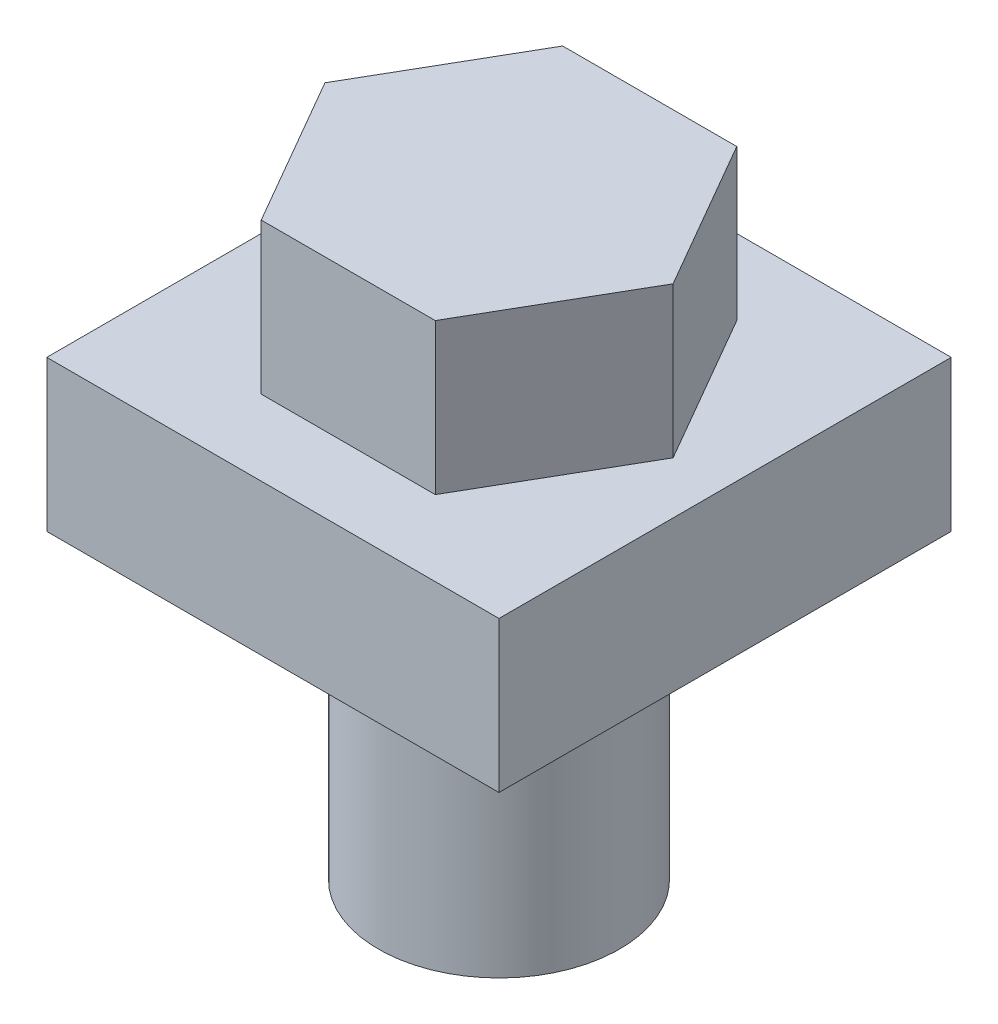
ISO-10303-21;
HEADER;
FILE_DESCRIPTION(('STEP AP214'),'2;1');
FILE_NAME('part.step','',(''),(''),'','','');
FILE_SCHEMA(('AUTOMOTIVE_DESIGN { 1 0 10303 214 1 1 1 1 }'));
ENDSEC;
DATA;
#1=APPLICATION_CONTEXT('core data for automotive mechanical design processes');
#2=APPLICATION_PROTOCOL_DEFINITION('international standard','automotive_design',2000,#1);
#3=PRODUCT_CONTEXT('',#1,'mechanical');
#4=PRODUCT('Part','Part','',(#3));
#5=PRODUCT_RELATED_PRODUCT_CATEGORY('part','',(#4));
#6=PRODUCT_DEFINITION_FORMATION('','',#4);
#7=PRODUCT_DEFINITION_CONTEXT('part definition',#1,'design');
#8=PRODUCT_DEFINITION('design','',#6,#7);
#9=PRODUCT_DEFINITION_SHAPE('','',#8);
#10=(LENGTH_UNIT() NAMED_UNIT(*) SI_UNIT(.MILLI.,.METRE.));
#11=(NAMED_UNIT(*) PLANE_ANGLE_UNIT() SI_UNIT($,.RADIAN.));
#12=(NAMED_UNIT(*) SI_UNIT($,.STERADIAN.) SOLID_ANGLE_UNIT());
#13=UNCERTAINTY_MEASURE_WITH_UNIT(LENGTH_MEASURE(1.E-05),#10,'distance_accuracy_value','');
#14=(GEOMETRIC_REPRESENTATION_CONTEXT(3) GLOBAL_UNCERTAINTY_ASSIGNED_CONTEXT((#13)) GLOBAL_UNIT_ASSIGNED_CONTEXT((#10,
#11,#12)) REPRESENTATION_CONTEXT('',''));
#15=CARTESIAN_POINT('',(0.,0.,0.));
#16=DIRECTION('',(0.,0.,1.));
#17=DIRECTION('',(1.,0.,0.));
#18=AXIS2_PLACEMENT_3D('',#15,#16,#17);
#19=CARTESIAN_POINT('',(-7.5,5.,7.5));
#20=DIRECTION('',(1.,0.,0.));
#21=DIRECTION('',(0.,0.,-1.));
#22=AXIS2_PLACEMENT_3D('',#19,#20,#21);
#23=PLANE('',#22);
#24=DIRECTION('',(0.,0.,1.));
#25=VECTOR('',#24,1.);
#26=CARTESIAN_POINT('',(-7.5,0.,7.5));
#27=LINE('',#26,#25);
#28=CARTESIAN_POINT('',(-7.5,0.,-7.5));
#29=VERTEX_POINT('',#28);
#30=CARTESIAN_POINT('',(-7.5,0.,7.5));
#31=VERTEX_POINT('',#30);
#32=EDGE_CURVE('E134',#29,#31,#27,.T.);
#33=ORIENTED_EDGE('',*,*,#32,.T.);
#34=DIRECTION('',(0.,-1.,0.));
#35=VECTOR('',#34,1.);
#36=CARTESIAN_POINT('',(-7.5,5.,7.5));
#37=LINE('',#36,#35);
#38=CARTESIAN_POINT('',(-7.5,5.,7.5));
#39=VERTEX_POINT('',#38);
#40=EDGE_CURVE('E40',#39,#31,#37,.T.);
#41=ORIENTED_EDGE('',*,*,#40,.F.);
#42=DIRECTION('',(0.,0.,1.));
#43=VECTOR('',#42,1.);
#44=CARTESIAN_POINT('',(-7.5,5.,7.5));
#45=LINE('',#44,#43);
#46=CARTESIAN_POINT('',(-7.5,5.,-7.5));
#47=VERTEX_POINT('',#46);
#48=EDGE_CURVE('E143',#47,#39,#45,.T.);
#49=ORIENTED_EDGE('',*,*,#48,.F.);
#50=DIRECTION('',(0.,-1.,0.));
#51=VECTOR('',#50,1.);
#52=CARTESIAN_POINT('',(-7.5,5.,-7.5));
#53=LINE('',#52,#51);
#54=EDGE_CURVE('E152',#47,#29,#53,.T.);
#55=ORIENTED_EDGE('',*,*,#54,.T.);
#56=EDGE_LOOP('',(#33,#41,#49,#55));
#57=FACE_BOUND('',#56,.T.);
#58=ADVANCED_FACE('F37',(#57),#23,.F.);
#59=CARTESIAN_POINT('',(7.5,5.,7.5));
#60=DIRECTION('',(0.,0.,-1.));
#61=DIRECTION('',(-1.,0.,0.));
#62=AXIS2_PLACEMENT_3D('',#59,#60,#61);
#63=PLANE('',#62);
#64=DIRECTION('',(1.,0.,0.));
#65=VECTOR('',#64,1.);
#66=CARTESIAN_POINT('',(7.5,0.,7.5));
#67=LINE('',#66,#65);
#68=CARTESIAN_POINT('',(7.5,0.,7.5));
#69=VERTEX_POINT('',#68);
#70=EDGE_CURVE('E137',#31,#69,#67,.T.);
#71=ORIENTED_EDGE('',*,*,#70,.T.);
#72=DIRECTION('',(0.,-1.,0.));
#73=VECTOR('',#72,1.);
#74=CARTESIAN_POINT('',(7.5,5.,7.5));
#75=LINE('',#74,#73);
#76=CARTESIAN_POINT('',(7.5,5.,7.5));
#77=VERTEX_POINT('',#76);
#78=EDGE_CURVE('E162',#77,#69,#75,.T.);
#79=ORIENTED_EDGE('',*,*,#78,.F.);
#80=DIRECTION('',(1.,0.,0.));
#81=VECTOR('',#80,1.);
#82=CARTESIAN_POINT('',(7.5,5.,7.5));
#83=LINE('',#82,#81);
#84=EDGE_CURVE('E146',#39,#77,#83,.T.);
#85=ORIENTED_EDGE('',*,*,#84,.F.);
#86=ORIENTED_EDGE('',*,*,#40,.T.);
#87=EDGE_LOOP('',(#71,#79,#85,#86));
#88=FACE_BOUND('',#87,.T.);
#89=ADVANCED_FACE('F171',(#88),#63,.F.);
#90=CARTESIAN_POINT('',(7.5,5.,7.5));
#91=DIRECTION('',(-1.,0.,0.));
#92=DIRECTION('',(0.,0.,1.));
#93=AXIS2_PLACEMENT_3D('',#90,#91,#92);
#94=PLANE('',#93);
#95=DIRECTION('',(0.,0.,-1.));
#96=VECTOR('',#95,1.);
#97=CARTESIAN_POINT('',(7.5,0.,7.5));
#98=LINE('',#97,#96);
#99=CARTESIAN_POINT('',(7.5,0.,-7.5));
#100=VERTEX_POINT('',#99);
#101=EDGE_CURVE('E155',#69,#100,#98,.T.);
#102=ORIENTED_EDGE('',*,*,#101,.T.);
#103=DIRECTION('',(0.,-1.,0.));
#104=VECTOR('',#103,1.);
#105=CARTESIAN_POINT('',(7.5,5.,-7.5));
#106=LINE('',#105,#104);
#107=CARTESIAN_POINT('',(7.5,5.,-7.5));
#108=VERTEX_POINT('',#107);
#109=EDGE_CURVE('E160',#108,#100,#106,.T.);
#110=ORIENTED_EDGE('',*,*,#109,.F.);
#111=DIRECTION('',(0.,0.,-1.));
#112=VECTOR('',#111,1.);
#113=CARTESIAN_POINT('',(7.5,5.,7.5));
#114=LINE('',#113,#112);
#115=EDGE_CURVE('E149',#77,#108,#114,.T.);
#116=ORIENTED_EDGE('',*,*,#115,.F.);
#117=ORIENTED_EDGE('',*,*,#78,.T.);
#118=EDGE_LOOP('',(#102,#110,#116,#117));
#119=FACE_BOUND('',#118,.T.);
#120=ADVANCED_FACE('F180',(#119),#94,.F.);
#121=CARTESIAN_POINT('',(7.5,5.,-7.5));
#122=DIRECTION('',(0.,0.,1.));
#123=DIRECTION('',(1.,0.,0.));
#124=AXIS2_PLACEMENT_3D('',#121,#122,#123);
#125=PLANE('',#124);
#126=DIRECTION('',(-1.,0.,0.));
#127=VECTOR('',#126,1.);
#128=CARTESIAN_POINT('',(7.5,0.,-7.5));
#129=LINE('',#128,#127);
#130=EDGE_CURVE('E147',#100,#29,#129,.T.);
#131=ORIENTED_EDGE('',*,*,#130,.T.);
#132=ORIENTED_EDGE('',*,*,#54,.F.);
#133=DIRECTION('',(-1.,0.,0.));
#134=VECTOR('',#133,1.);
#135=CARTESIAN_POINT('',(7.5,5.,-7.5));
#136=LINE('',#135,#134);
#137=EDGE_CURVE('E151',#108,#47,#136,.T.);
#138=ORIENTED_EDGE('',*,*,#137,.F.);
#139=ORIENTED_EDGE('',*,*,#109,.T.);
#140=EDGE_LOOP('',(#131,#132,#138,#139));
#141=FACE_BOUND('',#140,.T.);
#142=ADVANCED_FACE('F183',(#141),#125,.F.);
#143=CARTESIAN_POINT('',(0.,5.,0.));
#144=DIRECTION('',(0.,1.,0.));
#145=DIRECTION('',(0.,0.,1.));
#146=AXIS2_PLACEMENT_3D('',#143,#144,#145);
#147=PLANE('',#146);
#148=DIRECTION('',(-1.,0.,0.));
#149=VECTOR('',#148,1.);
#150=CARTESIAN_POINT('',(2.88675134594813,5.,-5.));
#151=LINE('',#150,#149);
#152=CARTESIAN_POINT('',(2.88675134594813,5.,-5.));
#153=VERTEX_POINT('',#152);
#154=CARTESIAN_POINT('',(-2.88675134594813,5.,-5.));
#155=VERTEX_POINT('',#154);
#156=EDGE_CURVE('E52',#153,#155,#151,.T.);
#157=ORIENTED_EDGE('',*,*,#156,.F.);
#158=DIRECTION('',(-0.5,0.,-0.866025403784439));
#159=VECTOR('',#158,1.);
#160=CARTESIAN_POINT('',(5.77350269189626,5.,0.));
#161=LINE('',#160,#159);
#162=CARTESIAN_POINT('',(5.77350269189626,5.,0.));
#163=VERTEX_POINT('',#162);
#164=EDGE_CURVE('E56',#163,#153,#161,.T.);
#165=ORIENTED_EDGE('',*,*,#164,.F.);
#166=DIRECTION('',(0.5,0.,-0.866025403784439));
#167=VECTOR('',#166,1.);
#168=CARTESIAN_POINT('',(2.88675134594813,5.,5.));
#169=LINE('',#168,#167);
#170=CARTESIAN_POINT('',(2.88675134594813,5.,5.));
#171=VERTEX_POINT('',#170);
#172=EDGE_CURVE('E368',#171,#163,#169,.T.);
#173=ORIENTED_EDGE('',*,*,#172,.F.);
#174=DIRECTION('',(1.,0.,0.));
#175=VECTOR('',#174,1.);
#176=CARTESIAN_POINT('',(-2.88675134594812,5.,5.));
#177=LINE('',#176,#175);
#178=CARTESIAN_POINT('',(-2.88675134594812,5.,5.));
#179=VERTEX_POINT('',#178);
#180=EDGE_CURVE('E365',#179,#171,#177,.T.);
#181=ORIENTED_EDGE('',*,*,#180,.F.);
#182=DIRECTION('',(0.5,0.,0.866025403784438));
#183=VECTOR('',#182,1.);
#184=CARTESIAN_POINT('',(-5.77350269189626,5.,0.));
#185=LINE('',#184,#183);
#186=CARTESIAN_POINT('',(-5.77350269189626,5.,0.));
#187=VERTEX_POINT('',#186);
#188=EDGE_CURVE('E362',#187,#179,#185,.T.);
#189=ORIENTED_EDGE('',*,*,#188,.F.);
#190=DIRECTION('',(-0.5,0.,0.866025403784439));
#191=VECTOR('',#190,1.);
#192=CARTESIAN_POINT('',(-2.88675134594813,5.,-5.));
#193=LINE('',#192,#191);
#194=EDGE_CURVE('E351',#155,#187,#193,.T.);
#195=ORIENTED_EDGE('',*,*,#194,.F.);
#196=EDGE_LOOP('',(#157,#165,#173,#181,#189,#195));
#197=FACE_BOUND('',#196,.T.);
#198=ORIENTED_EDGE('',*,*,#48,.T.);
#199=ORIENTED_EDGE('',*,*,#84,.T.);
#200=ORIENTED_EDGE('',*,*,#115,.T.);
#201=ORIENTED_EDGE('',*,*,#137,.T.);
#202=EDGE_LOOP('',(#198,#199,#200,#201));
#203=FACE_BOUND('',#202,.T.);
#204=ADVANCED_FACE('F185',(#197,#203),#147,.T.);
#205=CARTESIAN_POINT('',(0.,0.,0.));
#206=DIRECTION('',(0.,1.,0.));
#207=DIRECTION('',(0.,0.,1.));
#208=AXIS2_PLACEMENT_3D('',#205,#206,#207);
#209=PLANE('',#208);
#210=CARTESIAN_POINT('',(0.,0.,0.));
#211=DIRECTION('',(0.,-1.,0.));
#212=DIRECTION('',(0.,0.,-1.));
#213=AXIS2_PLACEMENT_3D('',#210,#211,#212);
#214=CIRCLE('',#213,4.);
#215=CARTESIAN_POINT('',(0.,0.,-4.));
#216=VERTEX_POINT('',#215);
#217=EDGE_CURVE('E11',#216,#216,#214,.T.);
#218=ORIENTED_EDGE('',*,*,#217,.F.);
#219=EDGE_LOOP('',(#218));
#220=FACE_BOUND('',#219,.T.);
#221=ORIENTED_EDGE('',*,*,#32,.F.);
#222=ORIENTED_EDGE('',*,*,#130,.F.);
#223=ORIENTED_EDGE('',*,*,#101,.F.);
#224=ORIENTED_EDGE('',*,*,#70,.F.);
#225=EDGE_LOOP('',(#221,#222,#223,#224));
#226=FACE_BOUND('',#225,.T.);
#227=ADVANCED_FACE('F178',(#220,#226),#209,.F.);
#228=CARTESIAN_POINT('',(2.88675134594813,10.,-5.));
#229=DIRECTION('',(0.,0.,1.));
#230=DIRECTION('',(1.,0.,0.));
#231=AXIS2_PLACEMENT_3D('',#228,#229,#230);
#232=PLANE('',#231);
#233=ORIENTED_EDGE('',*,*,#156,.T.);
#234=DIRECTION('',(0.,-1.,0.));
#235=VECTOR('',#234,1.);
#236=CARTESIAN_POINT('',(-2.88675134594813,10.,-5.));
#237=LINE('',#236,#235);
#238=CARTESIAN_POINT('',(-2.88675134594813,10.,-5.));
#239=VERTEX_POINT('',#238);
#240=EDGE_CURVE('E117',#239,#155,#237,.T.);
#241=ORIENTED_EDGE('',*,*,#240,.F.);
#242=DIRECTION('',(-1.,0.,0.));
#243=VECTOR('',#242,1.);
#244=CARTESIAN_POINT('',(2.88675134594813,10.,-5.));
#245=LINE('',#244,#243);
#246=CARTESIAN_POINT('',(2.88675134594813,10.,-5.));
#247=VERTEX_POINT('',#246);
#248=EDGE_CURVE('E123',#247,#239,#245,.T.);
#249=ORIENTED_EDGE('',*,*,#248,.F.);
#250=DIRECTION('',(0.,-1.,0.));
#251=VECTOR('',#250,1.);
#252=CARTESIAN_POINT('',(2.88675134594813,10.,-5.));
#253=LINE('',#252,#251);
#254=EDGE_CURVE('E359',#247,#153,#253,.T.);
#255=ORIENTED_EDGE('',*,*,#254,.T.);
#256=EDGE_LOOP('',(#233,#241,#249,#255));
#257=FACE_BOUND('',#256,.T.);
#258=ADVANCED_FACE('F133',(#257),#232,.F.);
#259=CARTESIAN_POINT('',(-2.88675134594813,10.,-5.));
#260=DIRECTION('',(0.866025403784439,0.,0.5));
#261=DIRECTION('',(0.5,0.,-0.866025403784439));
#262=AXIS2_PLACEMENT_3D('',#259,#260,#261);
#263=PLANE('',#262);
#264=ORIENTED_EDGE('',*,*,#194,.T.);
#265=DIRECTION('',(0.,-1.,0.));
#266=VECTOR('',#265,1.);
#267=CARTESIAN_POINT('',(-5.77350269189626,10.,0.));
#268=LINE('',#267,#266);
#269=CARTESIAN_POINT('',(-5.77350269189626,10.,0.));
#270=VERTEX_POINT('',#269);
#271=EDGE_CURVE('E119',#270,#187,#268,.T.);
#272=ORIENTED_EDGE('',*,*,#271,.F.);
#273=DIRECTION('',(-0.5,0.,0.866025403784439));
#274=VECTOR('',#273,1.);
#275=CARTESIAN_POINT('',(-2.88675134594813,10.,-5.));
#276=LINE('',#275,#274);
#277=EDGE_CURVE('E112',#239,#270,#276,.T.);
#278=ORIENTED_EDGE('',*,*,#277,.F.);
#279=ORIENTED_EDGE('',*,*,#240,.T.);
#280=EDGE_LOOP('',(#264,#272,#278,#279));
#281=FACE_BOUND('',#280,.T.);
#282=ADVANCED_FACE('F115',(#281),#263,.F.);
#283=CARTESIAN_POINT('',(-5.77350269189626,10.,0.));
#284=DIRECTION('',(0.866025403784439,0.,-0.5));
#285=DIRECTION('',(-0.5,0.,-0.866025403784439));
#286=AXIS2_PLACEMENT_3D('',#283,#284,#285);
#287=PLANE('',#286);
#288=ORIENTED_EDGE('',*,*,#188,.T.);
#289=DIRECTION('',(0.,-1.,0.));
#290=VECTOR('',#289,1.);
#291=CARTESIAN_POINT('',(-2.88675134594812,10.,5.));
#292=LINE('',#291,#290);
#293=CARTESIAN_POINT('',(-2.88675134594812,10.,5.));
#294=VERTEX_POINT('',#293);
#295=EDGE_CURVE('E139',#294,#179,#292,.T.);
#296=ORIENTED_EDGE('',*,*,#295,.F.);
#297=DIRECTION('',(0.5,0.,0.866025403784438));
#298=VECTOR('',#297,1.);
#299=CARTESIAN_POINT('',(-5.77350269189626,10.,0.));
#300=LINE('',#299,#298);
#301=EDGE_CURVE('E122',#270,#294,#300,.T.);
#302=ORIENTED_EDGE('',*,*,#301,.F.);
#303=ORIENTED_EDGE('',*,*,#271,.T.);
#304=EDGE_LOOP('',(#288,#296,#302,#303));
#305=FACE_BOUND('',#304,.T.);
#306=ADVANCED_FACE('F234',(#305),#287,.F.);
#307=CARTESIAN_POINT('',(-2.88675134594812,10.,5.));
#308=DIRECTION('',(0.,0.,-1.));
#309=DIRECTION('',(-1.,0.,0.));
#310=AXIS2_PLACEMENT_3D('',#307,#308,#309);
#311=PLANE('',#310);
#312=ORIENTED_EDGE('',*,*,#180,.T.);
#313=DIRECTION('',(0.,-1.,0.));
#314=VECTOR('',#313,1.);
#315=CARTESIAN_POINT('',(2.88675134594813,10.,5.));
#316=LINE('',#315,#314);
#317=CARTESIAN_POINT('',(2.88675134594813,10.,5.));
#318=VERTEX_POINT('',#317);
#319=EDGE_CURVE('E375',#318,#171,#316,.T.);
#320=ORIENTED_EDGE('',*,*,#319,.F.);
#321=DIRECTION('',(1.,0.,0.));
#322=VECTOR('',#321,1.);
#323=CARTESIAN_POINT('',(-2.88675134594812,10.,5.));
#324=LINE('',#323,#322);
#325=EDGE_CURVE('E355',#294,#318,#324,.T.);
#326=ORIENTED_EDGE('',*,*,#325,.F.);
#327=ORIENTED_EDGE('',*,*,#295,.T.);
#328=EDGE_LOOP('',(#312,#320,#326,#327));
#329=FACE_BOUND('',#328,.T.);
#330=ADVANCED_FACE('F244',(#329),#311,.F.);
#331=CARTESIAN_POINT('',(2.88675134594813,10.,5.));
#332=DIRECTION('',(-0.866025403784439,0.,-0.5));
#333=DIRECTION('',(-0.5,0.,0.866025403784439));
#334=AXIS2_PLACEMENT_3D('',#331,#332,#333);
#335=PLANE('',#334);
#336=ORIENTED_EDGE('',*,*,#172,.T.);
#337=DIRECTION('',(0.,-1.,0.));
#338=VECTOR('',#337,1.);
#339=CARTESIAN_POINT('',(5.77350269189626,10.,0.));
#340=LINE('',#339,#338);
#341=CARTESIAN_POINT('',(5.77350269189626,10.,0.));
#342=VERTEX_POINT('',#341);
#343=EDGE_CURVE('E372',#342,#163,#340,.T.);
#344=ORIENTED_EDGE('',*,*,#343,.F.);
#345=DIRECTION('',(0.5,0.,-0.866025403784439));
#346=VECTOR('',#345,1.);
#347=CARTESIAN_POINT('',(2.88675134594813,10.,5.));
#348=LINE('',#347,#346);
#349=EDGE_CURVE('E357',#318,#342,#348,.T.);
#350=ORIENTED_EDGE('',*,*,#349,.F.);
#351=ORIENTED_EDGE('',*,*,#319,.T.);
#352=EDGE_LOOP('',(#336,#344,#350,#351));
#353=FACE_BOUND('',#352,.T.);
#354=ADVANCED_FACE('F255',(#353),#335,.F.);
#355=CARTESIAN_POINT('',(5.77350269189626,10.,0.));
#356=DIRECTION('',(-0.866025403784439,0.,0.5));
#357=DIRECTION('',(0.5,0.,0.866025403784439));
#358=AXIS2_PLACEMENT_3D('',#355,#356,#357);
#359=PLANE('',#358);
#360=ORIENTED_EDGE('',*,*,#164,.T.);
#361=ORIENTED_EDGE('',*,*,#254,.F.);
#362=DIRECTION('',(-0.5,0.,-0.866025403784439));
#363=VECTOR('',#362,1.);
#364=CARTESIAN_POINT('',(5.77350269189626,10.,0.));
#365=LINE('',#364,#363);
#366=EDGE_CURVE('E128',#342,#247,#365,.T.);
#367=ORIENTED_EDGE('',*,*,#366,.F.);
#368=ORIENTED_EDGE('',*,*,#343,.T.);
#369=EDGE_LOOP('',(#360,#361,#367,#368));
#370=FACE_BOUND('',#369,.T.);
#371=ADVANCED_FACE('F266',(#370),#359,.F.);
#372=CARTESIAN_POINT('',(0.,10.,0.));
#373=DIRECTION('',(0.,1.,0.));
#374=DIRECTION('',(0.,0.,1.));
#375=AXIS2_PLACEMENT_3D('',#372,#373,#374);
#376=PLANE('',#375);
#377=ORIENTED_EDGE('',*,*,#248,.T.);
#378=ORIENTED_EDGE('',*,*,#277,.T.);
#379=ORIENTED_EDGE('',*,*,#301,.T.);
#380=ORIENTED_EDGE('',*,*,#325,.T.);
#381=ORIENTED_EDGE('',*,*,#349,.T.);
#382=ORIENTED_EDGE('',*,*,#366,.T.);
#383=EDGE_LOOP('',(#377,#378,#379,#380,#381,#382));
#384=FACE_BOUND('',#383,.T.);
#385=ADVANCED_FACE('F126',(#384),#376,.T.);
#386=CARTESIAN_POINT('',(0.,-10.,0.));
#387=DIRECTION('',(0.,1.,0.));
#388=DIRECTION('',(0.,0.,1.));
#389=AXIS2_PLACEMENT_3D('',#386,#387,#388);
#390=CYLINDRICAL_SURFACE('',#389,4.);
#391=CARTESIAN_POINT('',(0.,-10.,0.));
#392=DIRECTION('',(0.,-1.,0.));
#393=DIRECTION('',(0.,0.,-1.));
#394=AXIS2_PLACEMENT_3D('',#391,#392,#393);
#395=CIRCLE('',#394,4.);
#396=CARTESIAN_POINT('',(0.,-10.,-4.));
#397=VERTEX_POINT('',#396);
#398=EDGE_CURVE('E349',#397,#397,#395,.T.);
#399=ORIENTED_EDGE('',*,*,#398,.F.);
#400=EDGE_LOOP('',(#399));
#401=FACE_BOUND('',#400,.T.);
#402=ORIENTED_EDGE('',*,*,#217,.T.);
#403=EDGE_LOOP('',(#402));
#404=FACE_BOUND('',#403,.T.);
#405=ADVANCED_FACE('F287',(#401,#404),#390,.T.);
#406=CARTESIAN_POINT('',(0.,-10.,0.));
#407=DIRECTION('',(0.,-1.,0.));
#408=DIRECTION('',(0.,0.,-1.));
#409=AXIS2_PLACEMENT_3D('',#406,#407,#408);
#410=PLANE('',#409);
#411=ORIENTED_EDGE('',*,*,#398,.T.);
#412=EDGE_LOOP('',(#411));
#413=FACE_BOUND('',#412,.T.);
#414=ADVANCED_FACE('F303',(#413),#410,.T.);
#415=CLOSED_SHELL('',(#58,#89,#120,#142,#204,#227,#258,#282,#306,#330,#354,#371,#385,#405,#414));
#416=MANIFOLD_SOLID_BREP('B2',#415);
#417=ADVANCED_BREP_SHAPE_REPRESENTATION('',(#18,#416),#14);
#418=SHAPE_DEFINITION_REPRESENTATION(#9,#417);
ENDSEC;
END-ISO-10303-21;
